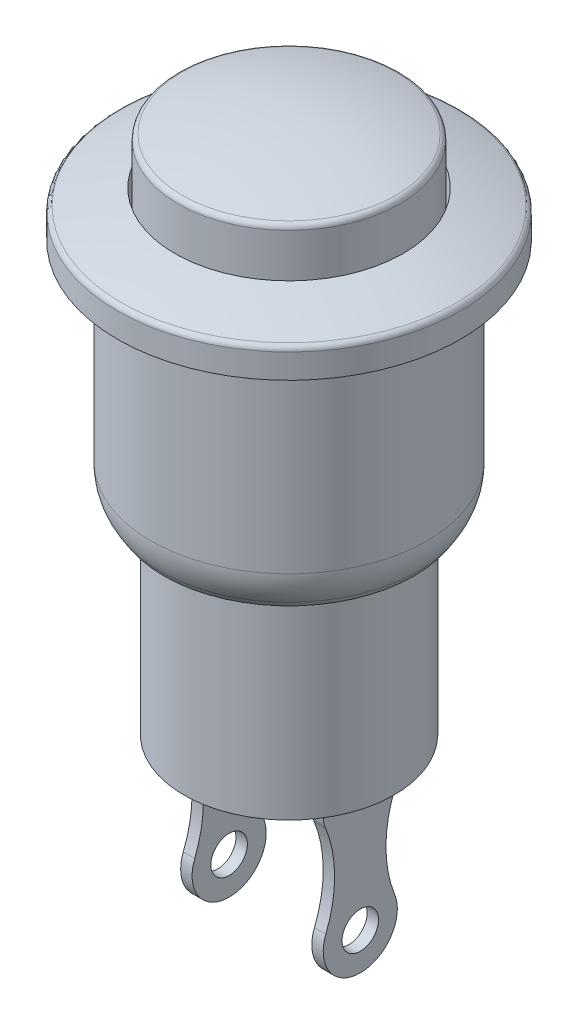
ISO-10303-21;
HEADER;
FILE_DESCRIPTION(('STEP AP214'),'2;1');
FILE_NAME('part.step','',(''),(''),'','','');
FILE_SCHEMA(('AUTOMOTIVE_DESIGN { 1 0 10303 214 1 1 1 1 }'));
ENDSEC;
DATA;
#1=APPLICATION_CONTEXT('core data for automotive mechanical design processes');
#2=APPLICATION_PROTOCOL_DEFINITION('international standard','automotive_design',2000,#1);
#3=PRODUCT_CONTEXT('',#1,'mechanical');
#4=PRODUCT('Part','Part','',(#3));
#5=PRODUCT_RELATED_PRODUCT_CATEGORY('part','',(#4));
#6=PRODUCT_DEFINITION_FORMATION('','',#4);
#7=PRODUCT_DEFINITION_CONTEXT('part definition',#1,'design');
#8=PRODUCT_DEFINITION('design','',#6,#7);
#9=PRODUCT_DEFINITION_SHAPE('','',#8);
#10=(LENGTH_UNIT() NAMED_UNIT(*) SI_UNIT(.MILLI.,.METRE.));
#11=(NAMED_UNIT(*) PLANE_ANGLE_UNIT() SI_UNIT($,.RADIAN.));
#12=(NAMED_UNIT(*) SI_UNIT($,.STERADIAN.) SOLID_ANGLE_UNIT());
#13=UNCERTAINTY_MEASURE_WITH_UNIT(LENGTH_MEASURE(1.E-05),#10,'distance_accuracy_value','');
#14=(GEOMETRIC_REPRESENTATION_CONTEXT(3) GLOBAL_UNCERTAINTY_ASSIGNED_CONTEXT((#13)) GLOBAL_UNIT_ASSIGNED_CONTEXT((#10,
#11,#12)) REPRESENTATION_CONTEXT('',''));
#15=CARTESIAN_POINT('',(0.,0.,0.));
#16=DIRECTION('',(0.,0.,1.));
#17=DIRECTION('',(1.,0.,0.));
#18=AXIS2_PLACEMENT_3D('',#15,#16,#17);
#19=CARTESIAN_POINT('',(-2.5,-6.,-1.3));
#20=DIRECTION('',(0.,0.,1.));
#21=DIRECTION('',(1.,0.,0.));
#22=AXIS2_PLACEMENT_3D('',#19,#20,#21);
#23=PLANE('',#22);
#24=DIRECTION('',(0.,1.,0.));
#25=VECTOR('',#24,1.);
#26=CARTESIAN_POINT('',(-2.1,-6.,-1.3));
#27=LINE('',#26,#25);
#28=CARTESIAN_POINT('',(-2.1,-0.59175240236366,-1.3));
#29=VERTEX_POINT('',#28);
#30=CARTESIAN_POINT('',(-2.1,0.,-1.3));
#31=VERTEX_POINT('',#30);
#32=EDGE_CURVE('E239',#29,#31,#27,.T.);
#33=ORIENTED_EDGE('',*,*,#32,.F.);
#34=DIRECTION('',(-1.,0.,0.));
#35=VECTOR('',#34,1.);
#36=CARTESIAN_POINT('',(-2.5,-0.59175240236366,-1.3));
#37=LINE('',#36,#35);
#38=CARTESIAN_POINT('',(-2.5,-0.59175240236366,-1.3));
#39=VERTEX_POINT('',#38);
#40=EDGE_CURVE('E44',#29,#39,#37,.T.);
#41=ORIENTED_EDGE('',*,*,#40,.T.);
#42=DIRECTION('',(0.,1.,0.));
#43=VECTOR('',#42,1.);
#44=CARTESIAN_POINT('',(-2.5,-6.,-1.3));
#45=LINE('',#44,#43);
#46=CARTESIAN_POINT('',(-2.5,0.,-1.3));
#47=VERTEX_POINT('',#46);
#48=EDGE_CURVE('E241',#39,#47,#45,.T.);
#49=ORIENTED_EDGE('',*,*,#48,.T.);
#50=DIRECTION('',(1.,0.,0.));
#51=VECTOR('',#50,1.);
#52=CARTESIAN_POINT('',(-2.5,0.,-1.3));
#53=LINE('',#52,#51);
#54=EDGE_CURVE('E226',#47,#31,#53,.T.);
#55=ORIENTED_EDGE('',*,*,#54,.T.);
#56=EDGE_LOOP('',(#33,#41,#49,#55));
#57=FACE_BOUND('',#56,.T.);
#58=ADVANCED_FACE('F36',(#57),#23,.F.);
#59=CARTESIAN_POINT('',(2.5,-6.,-1.3));
#60=DIRECTION('',(0.,0.,1.));
#61=DIRECTION('',(1.,0.,0.));
#62=AXIS2_PLACEMENT_3D('',#59,#60,#61);
#63=PLANE('',#62);
#64=DIRECTION('',(0.,1.,0.));
#65=VECTOR('',#64,1.);
#66=CARTESIAN_POINT('',(2.5,-6.,-1.3));
#67=LINE('',#66,#65);
#68=CARTESIAN_POINT('',(2.5,-0.59175240236366,-1.3));
#69=VERTEX_POINT('',#68);
#70=CARTESIAN_POINT('',(2.5,0.,-1.3));
#71=VERTEX_POINT('',#70);
#72=EDGE_CURVE('E217',#69,#71,#67,.T.);
#73=ORIENTED_EDGE('',*,*,#72,.F.);
#74=DIRECTION('',(-1.,0.,0.));
#75=VECTOR('',#74,1.);
#76=CARTESIAN_POINT('',(2.5,-0.59175240236366,-1.3));
#77=LINE('',#76,#75);
#78=CARTESIAN_POINT('',(2.1,-0.59175240236366,-1.3));
#79=VERTEX_POINT('',#78);
#80=EDGE_CURVE('E315',#69,#79,#77,.T.);
#81=ORIENTED_EDGE('',*,*,#80,.T.);
#82=DIRECTION('',(0.,1.,0.));
#83=VECTOR('',#82,1.);
#84=CARTESIAN_POINT('',(2.1,-6.,-1.3));
#85=LINE('',#84,#83);
#86=CARTESIAN_POINT('',(2.1,0.,-1.3));
#87=VERTEX_POINT('',#86);
#88=EDGE_CURVE('E219',#79,#87,#85,.T.);
#89=ORIENTED_EDGE('',*,*,#88,.T.);
#90=DIRECTION('',(1.,0.,0.));
#91=VECTOR('',#90,1.);
#92=CARTESIAN_POINT('',(2.5,0.,-1.3));
#93=LINE('',#92,#91);
#94=EDGE_CURVE('E209',#87,#71,#93,.T.);
#95=ORIENTED_EDGE('',*,*,#94,.T.);
#96=EDGE_LOOP('',(#73,#81,#89,#95));
#97=FACE_BOUND('',#96,.T.);
#98=ADVANCED_FACE('F353',(#97),#63,.F.);
#99=CARTESIAN_POINT('',(0.,0.,0.));
#100=DIRECTION('',(0.,-1.,0.));
#101=DIRECTION('',(0.,0.,-1.));
#102=AXIS2_PLACEMENT_3D('',#99,#100,#101);
#103=PLANE('',#102);
#104=ORIENTED_EDGE('',*,*,#54,.F.);
#105=DIRECTION('',(0.,0.,-1.));
#106=VECTOR('',#105,1.);
#107=CARTESIAN_POINT('',(-2.5,0.,1.3));
#108=LINE('',#107,#106);
#109=CARTESIAN_POINT('',(-2.5,0.,1.3));
#110=VERTEX_POINT('',#109);
#111=EDGE_CURVE('E223',#110,#47,#108,.T.);
#112=ORIENTED_EDGE('',*,*,#111,.F.);
#113=DIRECTION('',(-1.,0.,0.));
#114=VECTOR('',#113,1.);
#115=CARTESIAN_POINT('',(-2.5,0.,1.3));
#116=LINE('',#115,#114);
#117=CARTESIAN_POINT('',(-2.1,0.,1.3));
#118=VERTEX_POINT('',#117);
#119=EDGE_CURVE('E232',#118,#110,#116,.T.);
#120=ORIENTED_EDGE('',*,*,#119,.F.);
#121=DIRECTION('',(0.,0.,1.));
#122=VECTOR('',#121,1.);
#123=CARTESIAN_POINT('',(-2.1,0.,1.3));
#124=LINE('',#123,#122);
#125=EDGE_CURVE('E229',#31,#118,#124,.T.);
#126=ORIENTED_EDGE('',*,*,#125,.F.);
#127=EDGE_LOOP('',(#104,#112,#120,#126));
#128=FACE_BOUND('',#127,.T.);
#129=CARTESIAN_POINT('',(0.,0.,0.));
#130=DIRECTION('',(0.,-1.,0.));
#131=DIRECTION('',(0.,0.,-1.));
#132=AXIS2_PLACEMENT_3D('',#129,#130,#131);
#133=CIRCLE('',#132,3.69);
#134=CARTESIAN_POINT('',(0.,0.,-3.69));
#135=VERTEX_POINT('',#134);
#136=EDGE_CURVE('E252',#135,#135,#133,.T.);
#137=ORIENTED_EDGE('',*,*,#136,.T.);
#138=EDGE_LOOP('',(#137));
#139=FACE_BOUND('',#138,.T.);
#140=DIRECTION('',(0.,0.,-1.));
#141=VECTOR('',#140,1.);
#142=CARTESIAN_POINT('',(2.1,0.,1.3));
#143=LINE('',#142,#141);
#144=CARTESIAN_POINT('',(2.1,0.,1.3));
#145=VERTEX_POINT('',#144);
#146=EDGE_CURVE('E206',#145,#87,#143,.T.);
#147=ORIENTED_EDGE('',*,*,#146,.F.);
#148=DIRECTION('',(-1.,0.,0.));
#149=VECTOR('',#148,1.);
#150=CARTESIAN_POINT('',(2.5,0.,1.3));
#151=LINE('',#150,#149);
#152=CARTESIAN_POINT('',(2.5,0.,1.3));
#153=VERTEX_POINT('',#152);
#154=EDGE_CURVE('E203',#153,#145,#151,.T.);
#155=ORIENTED_EDGE('',*,*,#154,.F.);
#156=DIRECTION('',(0.,0.,1.));
#157=VECTOR('',#156,1.);
#158=CARTESIAN_POINT('',(2.5,0.,1.3));
#159=LINE('',#158,#157);
#160=EDGE_CURVE('E212',#71,#153,#159,.T.);
#161=ORIENTED_EDGE('',*,*,#160,.F.);
#162=ORIENTED_EDGE('',*,*,#94,.F.);
#163=EDGE_LOOP('',(#147,#155,#161,#162));
#164=FACE_BOUND('',#163,.T.);
#165=ADVANCED_FACE('F330',(#128,#139,#164),#103,.T.);
#166=CARTESIAN_POINT('',(0.,0.,0.));
#167=DIRECTION('',(0.,-1.,0.));
#168=DIRECTION('',(0.,0.,-1.));
#169=AXIS2_PLACEMENT_3D('',#166,#167,#168);
#170=CYLINDRICAL_SURFACE('',#169,6.01);
#171=CARTESIAN_POINT('',(0.,15.8594915447855,0.));
#172=DIRECTION('',(0.,-1.,0.));
#173=DIRECTION('',(0.,0.,-1.));
#174=AXIS2_PLACEMENT_3D('',#171,#172,#173);
#175=CIRCLE('',#174,6.01);
#176=CARTESIAN_POINT('',(0.,15.8594915447855,-6.01));
#177=VERTEX_POINT('',#176);
#178=EDGE_CURVE('E270',#177,#177,#175,.T.);
#179=ORIENTED_EDGE('',*,*,#178,.T.);
#180=EDGE_LOOP('',(#179));
#181=FACE_BOUND('',#180,.T.);
#182=CARTESIAN_POINT('',(0.,15.,0.));
#183=DIRECTION('',(0.,-1.,0.));
#184=DIRECTION('',(0.,0.,-1.));
#185=AXIS2_PLACEMENT_3D('',#182,#183,#184);
#186=CIRCLE('',#185,6.01);
#187=CARTESIAN_POINT('',(0.,15.,-6.01));
#188=VERTEX_POINT('',#187);
#189=EDGE_CURVE('E243',#188,#188,#186,.T.);
#190=ORIENTED_EDGE('',*,*,#189,.F.);
#191=EDGE_LOOP('',(#190));
#192=FACE_BOUND('',#191,.T.);
#193=ADVANCED_FACE('F385',(#181,#192),#170,.T.);
#194=CARTESIAN_POINT('',(0.,-0.466749999999985,0.));
#195=DIRECTION('',(0.,-1.,0.));
#196=DIRECTION('',(1.,0.,0.));
#197=AXIS2_PLACEMENT_3D('',#194,#195,#196);
#198=SPHERICAL_SURFACE('',#197,17.5292314595506);
#199=CARTESIAN_POINT('',(0.,16.0479158448809,0.));
#200=DIRECTION('',(0.,-1.,0.));
#201=DIRECTION('',(0.,0.,-1.));
#202=AXIS2_PLACEMENT_3D('',#199,#200,#201);
#203=CIRCLE('',#202,5.87705432971521);
#204=CARTESIAN_POINT('',(5.87705432971521,16.0479158448809,0.));
#205=VERTEX_POINT('',#204);
#206=EDGE_CURVE('E273',#205,#205,#203,.F.);
#207=CARTESIAN_POINT('',(0.,16.6,0.));
#208=DIRECTION('',(0.,-1.,0.));
#209=DIRECTION('',(0.,0.,-1.));
#210=AXIS2_PLACEMENT_3D('',#207,#208,#209);
#211=CIRCLE('',#210,4.);
#212=CARTESIAN_POINT('',(3.99999999999999,16.6,0.));
#213=VERTEX_POINT('',#212);
#214=EDGE_CURVE('E261',#213,#213,#211,.T.);
#215=CARTESIAN_POINT('',(5.87705432971521,16.0479158448809,0.));
#216=CARTESIAN_POINT('',(5.85784312004759,16.0547525151923,0.));
#217=CARTESIAN_POINT('',(5.83861998081771,16.0615556631403,0.));
#218=CARTESIAN_POINT('',(5.80015007757914,16.0750948320988,0.));
#219=CARTESIAN_POINT('',(5.78090331357046,16.0818308531093,0.));
#220=CARTESIAN_POINT('',(5.74238639511996,16.0952356859819,0.));
#221=CARTESIAN_POINT('',(5.72311624067815,16.1019044978441,0.));
#222=CARTESIAN_POINT('',(5.68455277606906,16.1151748312468,0.));
#223=CARTESIAN_POINT('',(5.66525946590178,16.1217763527873,0.));
#224=CARTESIAN_POINT('',(5.62664992481077,16.1349120251345,0.));
#225=CARTESIAN_POINT('',(5.60733369388703,16.1414461759411,0.));
#226=CARTESIAN_POINT('',(5.56867854653681,16.1544470272442,0.));
#227=CARTESIAN_POINT('',(5.54933963011032,16.1609137277407,0.));
#228=CARTESIAN_POINT('',(5.51063934728309,16.1737795996646,0.));
#229=CARTESIAN_POINT('',(5.49127798088235,16.1801787710921,0.));
#230=CARTESIAN_POINT('',(5.45253303390894,16.1929095069428,0.));
#231=CARTESIAN_POINT('',(5.43314945333626,16.199241071366,0.));
#232=CARTESIAN_POINT('',(5.39436031409174,16.2118365160957,0.));
#233=CARTESIAN_POINT('',(5.37495475541988,16.2181003964023,0.));
#234=CARTESIAN_POINT('',(5.33612189631747,16.2305603966112,0.));
#235=CARTESIAN_POINT('',(5.31669459588691,16.2367565165134,0.));
#236=CARTESIAN_POINT('',(5.27781848987231,16.2490809204508,0.));
#237=CARTESIAN_POINT('',(5.25836968428827,16.2552092044861,0.));
#238=CARTESIAN_POINT('',(5.21945080483389,16.2673978620531,0.));
#239=CARTESIAN_POINT('',(5.19998073096354,16.2734582355849,0.));
#240=CARTESIAN_POINT('',(5.16101955206271,16.2855109983358,0.));
#241=CARTESIAN_POINT('',(5.14152844703223,16.2915033875549,0.));
#242=CARTESIAN_POINT('',(5.10252544319347,16.303420108699,0.));
#243=CARTESIAN_POINT('',(5.08301354438519,16.309344440624,0.));
#244=CARTESIAN_POINT('',(5.04396919062639,16.3211249750274,0.));
#245=CARTESIAN_POINT('',(5.02443673567587,16.3269811775058,0.));
#246=CARTESIAN_POINT('',(4.98535150751851,16.3386253816932,0.));
#247=CARTESIAN_POINT('',(4.96579873431168,16.3444133834023,0.));
#248=CARTESIAN_POINT('',(4.92667310777508,16.355921115559,0.));
#249=CARTESIAN_POINT('',(4.90710025444532,16.3616408460067,0.));
#250=CARTESIAN_POINT('',(4.86793470604079,16.3730119659798,0.));
#251=CARTESIAN_POINT('',(4.84834201096604,16.3786633555054,0.));
#252=CARTESIAN_POINT('',(4.80913701769111,16.3898977248061,0.));
#253=CARTESIAN_POINT('',(4.78952471949094,16.3954807045813,0.));
#254=CARTESIAN_POINT('',(4.75028075882353,16.406578186386,0.));
#255=CARTESIAN_POINT('',(4.73064909635629,16.4120926884156,0.));
#256=CARTESIAN_POINT('',(4.69136664624891,16.4230531475681,0.));
#257=CARTESIAN_POINT('',(4.67171585860877,16.428499104691,0.));
#258=CARTESIAN_POINT('',(4.6323953974827,16.4393224077037,0.));
#259=CARTESIAN_POINT('',(4.61272572399676,16.4446997535935,0.));
#260=CARTESIAN_POINT('',(4.57336773073619,16.4553857686493,0.));
#261=CARTESIAN_POINT('',(4.55367941096156,16.4606944378153,0.));
#262=CARTESIAN_POINT('',(4.51428436490781,16.4712430347691,0.));
#263=CARTESIAN_POINT('',(4.49457763862869,16.476482962557,0.));
#264=CARTESIAN_POINT('',(4.45514601957433,16.4868940129374,0.));
#265=CARTESIAN_POINT('',(4.4354211267991,16.49206513553,0.));
#266=CARTESIAN_POINT('',(4.39595341498215,16.5023385125408,0.));
#267=CARTESIAN_POINT('',(4.37621059594045,16.5074407669591,0.));
#268=CARTESIAN_POINT('',(4.33670727203844,16.5175763454805,0.));
#269=CARTESIAN_POINT('',(4.31694676717815,16.5226096695838,0.));
#270=CARTESIAN_POINT('',(4.27740831230255,16.5326073261753,0.));
#271=CARTESIAN_POINT('',(4.25763036228723,16.5375716586636,0.));
#272=CARTESIAN_POINT('',(4.21805725797658,16.5474312715611,0.));
#273=CARTESIAN_POINT('',(4.19826210368124,16.5523265519703,0.));
#274=CARTESIAN_POINT('',(4.15865483189893,16.5620480011029,0.));
#275=CARTESIAN_POINT('',(4.13884271441195,16.5668741698262,0.));
#276=CARTESIAN_POINT('',(4.09920175752693,16.5764573367613,0.));
#277=CARTESIAN_POINT('',(4.07937291812888,16.581214334973,0.));
#278=CARTESIAN_POINT('',(4.03969875895973,16.5906591031276,0.));
#279=CARTESIAN_POINT('',(4.01985343918863,16.5953468730704,0.));
#280=CARTESIAN_POINT('',(3.99999999999999,16.6,0.));
#281=B_SPLINE_CURVE_WITH_KNOTS('',3,(#215,#216,#217,#218,#219,#220,#221,#222,#223,#224,#225,
#226,#227,#228,#229,#230,#231,#232,#233,#234,#235,#236,#237,#238,#239,#240,#241,#242,#243,#244,
#245,#246,#247,#248,#249,#250,#251,#252,#253,#254,#255,#256,#257,#258,#259,#260,#261,#262,#263,
#264,#265,#266,#267,#268,#269,#270,#271,#272,#273,#274,#275,#276,#277,#278,#279,#280),
.UNSPECIFIED.,.F.,.F.,(4,2,2,2,2,2,2,2,2,2,2,2,2,2,2,2,2,2,2,2,2,2,2,2,2,2,2,2,2,2,2,2,4),(0.,
0.0611742751673028,0.122348550334602,0.183522825501902,0.244697100669206,0.30587137583651,
0.367045651003811,0.428219926171109,0.489394201338413,0.550568476505716,0.611742751673016,
0.672917026840316,0.73409130200762,0.795265577174924,0.856439852342224,0.917614127509524,
0.978788402676828,1.03996267784413,1.10113695301143,1.16231122817873,1.22348550334603,
1.28465977851334,1.34583405368064,1.40700832884794,1.46818260401524,1.52935687918254,
1.59053115434984,1.65170542951714,1.71287970468445,1.77405397985175,1.83522825501905,
1.89640253018635,1.95757680535365),.UNSPECIFIED.);
#282=EDGE_CURVE('BSEAM400',#205,#213,#281,.T.);
#283=ORIENTED_EDGE('',*,*,#206,.T.);
#284=ORIENTED_EDGE('',*,*,#214,.T.);
#285=ORIENTED_EDGE('',*,*,#282,.T.);
#286=ORIENTED_EDGE('',*,*,#282,.F.);
#287=EDGE_LOOP('',(#283,#285,#284,#286));
#288=FACE_BOUND('',#287,.T.);
#289=ADVANCED_FACE('F400',(#288),#198,.T.);
#290=CARTESIAN_POINT('',(0.,0.,0.));
#291=DIRECTION('',(0.,-1.,0.));
#292=DIRECTION('',(0.,0.,-1.));
#293=AXIS2_PLACEMENT_3D('',#290,#291,#292);
#294=CYLINDRICAL_SURFACE('',#293,4.);
#295=CARTESIAN_POINT('',(0.,15.0131906379404,0.));
#296=DIRECTION('',(0.,-1.,0.));
#297=DIRECTION('',(0.,0.,-1.));
#298=AXIS2_PLACEMENT_3D('',#295,#296,#297);
#299=CIRCLE('',#298,4.);
#300=CARTESIAN_POINT('',(0.,15.0131906379404,-4.));
#301=VERTEX_POINT('',#300);
#302=EDGE_CURVE('E258',#301,#301,#299,.T.);
#303=ORIENTED_EDGE('',*,*,#302,.T.);
#304=EDGE_LOOP('',(#303));
#305=FACE_BOUND('',#304,.T.);
#306=ORIENTED_EDGE('',*,*,#214,.F.);
#307=EDGE_LOOP('',(#306));
#308=FACE_BOUND('',#307,.T.);
#309=ADVANCED_FACE('F396',(#305,#308),#294,.F.);
#310=CARTESIAN_POINT('',(0.,15.0131906379404,0.));
#311=DIRECTION('',(0.,1.,0.));
#312=DIRECTION('',(0.,0.,1.));
#313=AXIS2_PLACEMENT_3D('',#310,#311,#312);
#314=PLANE('',#313);
#315=CARTESIAN_POINT('',(0.,15.0131906379404,0.));
#316=DIRECTION('',(0.,-1.,0.));
#317=DIRECTION('',(0.,0.,-1.));
#318=AXIS2_PLACEMENT_3D('',#315,#316,#317);
#319=CIRCLE('',#318,3.89);
#320=CARTESIAN_POINT('',(0.,15.0131906379404,-3.89));
#321=VERTEX_POINT('',#320);
#322=EDGE_CURVE('E255',#321,#321,#319,.T.);
#323=ORIENTED_EDGE('',*,*,#322,.T.);
#324=EDGE_LOOP('',(#323));
#325=FACE_BOUND('',#324,.T.);
#326=ORIENTED_EDGE('',*,*,#302,.F.);
#327=EDGE_LOOP('',(#326));
#328=FACE_BOUND('',#327,.T.);
#329=ADVANCED_FACE('F392',(#325,#328),#314,.T.);
#330=CARTESIAN_POINT('',(0.,0.,0.));
#331=DIRECTION('',(0.,-1.,0.));
#332=DIRECTION('',(0.,0.,-1.));
#333=AXIS2_PLACEMENT_3D('',#330,#331,#332);
#334=CYLINDRICAL_SURFACE('',#333,3.89);
#335=CARTESIAN_POINT('',(0.,18.0525692696262,0.));
#336=DIRECTION('',(0.,-1.,0.));
#337=DIRECTION('',(0.,0.,-1.));
#338=AXIS2_PLACEMENT_3D('',#335,#336,#337);
#339=CIRCLE('',#338,3.89);
#340=CARTESIAN_POINT('',(0.,18.0525692696262,-3.89));
#341=VERTEX_POINT('',#340);
#342=EDGE_CURVE('E264',#341,#341,#339,.T.);
#343=ORIENTED_EDGE('',*,*,#342,.T.);
#344=EDGE_LOOP('',(#343));
#345=FACE_BOUND('',#344,.T.);
#346=ORIENTED_EDGE('',*,*,#322,.F.);
#347=EDGE_LOOP('',(#346));
#348=FACE_BOUND('',#347,.T.);
#349=ADVANCED_FACE('F388',(#345,#348),#334,.T.);
#350=CARTESIAN_POINT('',(0.,5.88991666666667,0.));
#351=DIRECTION('',(0.,-1.,0.));
#352=DIRECTION('',(1.,0.,0.));
#353=AXIS2_PLACEMENT_3D('',#350,#351,#352);
#354=SPHERICAL_SURFACE('',#353,12.9100833333333);
#355=CARTESIAN_POINT('',(0.,18.2439551525348,0.));
#356=DIRECTION('',(0.,-1.,0.));
#357=DIRECTION('',(0.,0.,-1.));
#358=AXIS2_PLACEMENT_3D('',#355,#356,#357);
#359=CIRCLE('',#358,3.74806413543053);
#360=CARTESIAN_POINT('',(0.,18.2439551525348,-3.74806413543053));
#361=VERTEX_POINT('',#360);
#362=EDGE_CURVE('E267',#361,#361,#359,.F.);
#363=ORIENTED_EDGE('',*,*,#362,.T.);
#364=EDGE_LOOP('',(#363));
#365=FACE_BOUND('',#364,.T.);
#366=ADVANCED_FACE('F381',(#365),#354,.T.);
#367=CARTESIAN_POINT('',(0.,0.,0.));
#368=DIRECTION('',(0.,-1.,0.));
#369=DIRECTION('',(0.,0.,-1.));
#370=AXIS2_PLACEMENT_3D('',#367,#368,#369);
#371=CYLINDRICAL_SURFACE('',#370,3.69);
#372=CARTESIAN_POINT('',(0.,7.,0.));
#373=DIRECTION('',(0.,-1.,0.));
#374=DIRECTION('',(0.,0.,-1.));
#375=AXIS2_PLACEMENT_3D('',#372,#373,#374);
#376=CIRCLE('',#375,3.69);
#377=CARTESIAN_POINT('',(0.,7.,-3.69));
#378=VERTEX_POINT('',#377);
#379=EDGE_CURVE('E249',#378,#378,#376,.T.);
#380=ORIENTED_EDGE('',*,*,#379,.T.);
#381=EDGE_LOOP('',(#380));
#382=FACE_BOUND('',#381,.T.);
#383=ORIENTED_EDGE('',*,*,#136,.F.);
#384=EDGE_LOOP('',(#383));
#385=FACE_BOUND('',#384,.T.);
#386=ADVANCED_FACE('F377',(#382,#385),#371,.T.);
#387=CARTESIAN_POINT('',(0.,7.,0.));
#388=DIRECTION('',(0.,-1.,0.));
#389=DIRECTION('',(0.,0.,-1.));
#390=AXIS2_PLACEMENT_3D('',#387,#388,#389);
#391=PLANE('',#390);
#392=CARTESIAN_POINT('',(0.,7.,0.));
#393=DIRECTION('',(0.,-1.,0.));
#394=DIRECTION('',(0.,0.,-1.));
#395=AXIS2_PLACEMENT_3D('',#392,#393,#394);
#396=CIRCLE('',#395,4.38541468476175);
#397=CARTESIAN_POINT('',(0.,7.,-4.38541468476175));
#398=VERTEX_POINT('',#397);
#399=EDGE_CURVE('E276',#398,#398,#396,.T.);
#400=ORIENTED_EDGE('',*,*,#399,.T.);
#401=EDGE_LOOP('',(#400));
#402=FACE_BOUND('',#401,.T.);
#403=ORIENTED_EDGE('',*,*,#379,.F.);
#404=EDGE_LOOP('',(#403));
#405=FACE_BOUND('',#404,.T.);
#406=ADVANCED_FACE('F373',(#402,#405),#391,.T.);
#407=CARTESIAN_POINT('',(0.,0.,0.));
#408=DIRECTION('',(0.,-1.,0.));
#409=DIRECTION('',(0.,0.,-1.));
#410=AXIS2_PLACEMENT_3D('',#407,#408,#409);
#411=CYLINDRICAL_SURFACE('',#410,4.84);
#412=CARTESIAN_POINT('',(0.,8.29242698992415,0.));
#413=DIRECTION('',(0.,-1.,0.));
#414=DIRECTION('',(0.,0.,-1.));
#415=AXIS2_PLACEMENT_3D('',#412,#413,#414);
#416=CIRCLE('',#415,4.84);
#417=CARTESIAN_POINT('',(0.,8.29242698992415,-4.84));
#418=VERTEX_POINT('',#417);
#419=EDGE_CURVE('E279',#418,#418,#416,.F.);
#420=ORIENTED_EDGE('',*,*,#419,.T.);
#421=EDGE_LOOP('',(#420));
#422=FACE_BOUND('',#421,.T.);
#423=CARTESIAN_POINT('',(0.,15.,0.));
#424=DIRECTION('',(0.,-1.,0.));
#425=DIRECTION('',(0.,0.,-1.));
#426=AXIS2_PLACEMENT_3D('',#423,#424,#425);
#427=CIRCLE('',#426,4.84);
#428=CARTESIAN_POINT('',(0.,15.,-4.84));
#429=VERTEX_POINT('',#428);
#430=EDGE_CURVE('E246',#429,#429,#427,.T.);
#431=ORIENTED_EDGE('',*,*,#430,.T.);
#432=EDGE_LOOP('',(#431));
#433=FACE_BOUND('',#432,.T.);
#434=ADVANCED_FACE('F369',(#422,#433),#411,.T.);
#435=CARTESIAN_POINT('',(0.,15.,0.));
#436=DIRECTION('',(0.,-1.,0.));
#437=DIRECTION('',(0.,0.,-1.));
#438=AXIS2_PLACEMENT_3D('',#435,#436,#437);
#439=PLANE('',#438);
#440=ORIENTED_EDGE('',*,*,#189,.T.);
#441=EDGE_LOOP('',(#440));
#442=FACE_BOUND('',#441,.T.);
#443=ORIENTED_EDGE('',*,*,#430,.F.);
#444=EDGE_LOOP('',(#443));
#445=FACE_BOUND('',#444,.T.);
#446=ADVANCED_FACE('F365',(#442,#445),#439,.T.);
#447=CARTESIAN_POINT('',(0.,18.0525692696262,0.));
#448=DIRECTION('',(0.,-1.,0.));
#449=DIRECTION('',(0.,0.,-1.));
#450=AXIS2_PLACEMENT_3D('',#447,#448,#449);
#451=TOROIDAL_SURFACE('',#450,3.69,0.2);
#452=ORIENTED_EDGE('',*,*,#362,.F.);
#453=EDGE_LOOP('',(#452));
#454=FACE_BOUND('',#453,.T.);
#455=ORIENTED_EDGE('',*,*,#342,.F.);
#456=EDGE_LOOP('',(#455));
#457=FACE_BOUND('',#456,.T.);
#458=ADVANCED_FACE('F368',(#454,#457),#451,.T.);
#459=CARTESIAN_POINT('',(0.,15.8594915447855,0.));
#460=DIRECTION('',(0.,-1.,0.));
#461=DIRECTION('',(0.,0.,-1.));
#462=AXIS2_PLACEMENT_3D('',#459,#460,#461);
#463=TOROIDAL_SURFACE('',#462,5.81,0.2);
#464=ORIENTED_EDGE('',*,*,#206,.F.);
#465=EDGE_LOOP('',(#464));
#466=FACE_BOUND('',#465,.T.);
#467=ORIENTED_EDGE('',*,*,#178,.F.);
#468=EDGE_LOOP('',(#467));
#469=FACE_BOUND('',#468,.T.);
#470=ADVANCED_FACE('F410',(#466,#469),#463,.T.);
#471=CARTESIAN_POINT('',(0.,7.,0.));
#472=DIRECTION('',(0.,1.,0.));
#473=DIRECTION('',(0.,0.,1.));
#474=AXIS2_PLACEMENT_3D('',#471,#472,#473);
#475=CONICAL_SURFACE('',#474,4.38541468476175,0.575958653158124);
#476=CARTESIAN_POINT('',(0.,7.2031489198941,0.));
#477=DIRECTION('',(0.,-1.,0.));
#478=DIRECTION('',(0.,0.,-1.));
#479=AXIS2_PLACEMENT_3D('',#476,#477,#478);
#480=CIRCLE('',#479,4.51734113589085);
#481=CARTESIAN_POINT('',(0.,7.2031489198941,-4.51734113589085));
#482=VERTEX_POINT('',#481);
#483=EDGE_CURVE('E282',#482,#482,#480,.T.);
#484=ORIENTED_EDGE('',*,*,#483,.T.);
#485=EDGE_LOOP('',(#484));
#486=FACE_BOUND('',#485,.T.);
#487=ORIENTED_EDGE('',*,*,#399,.F.);
#488=EDGE_LOOP('',(#487));
#489=FACE_BOUND('',#488,.T.);
#490=ADVANCED_FACE('F414',(#486,#489),#475,.T.);
#491=CARTESIAN_POINT('',(0.,8.29242698992415,0.));
#492=DIRECTION('',(0.,-1.,0.));
#493=DIRECTION('',(0.,0.,-1.));
#494=AXIS2_PLACEMENT_3D('',#491,#492,#493);
#495=TOROIDAL_SURFACE('',#494,2.84,2.);
#496=ORIENTED_EDGE('',*,*,#483,.F.);
#497=EDGE_LOOP('',(#496));
#498=FACE_BOUND('',#497,.T.);
#499=ORIENTED_EDGE('',*,*,#419,.F.);
#500=EDGE_LOOP('',(#499));
#501=FACE_BOUND('',#500,.T.);
#502=ADVANCED_FACE('F363',(#498,#501),#495,.T.);
#503=CARTESIAN_POINT('',(-2.5,-6.,1.3));
#504=DIRECTION('',(1.,0.,0.));
#505=DIRECTION('',(0.,0.,-1.));
#506=AXIS2_PLACEMENT_3D('',#503,#504,#505);
#507=PLANE('',#506);
#508=CARTESIAN_POINT('',(-2.5,-4.7,0.));
#509=DIRECTION('',(-1.,0.,0.));
#510=DIRECTION('',(0.,0.,1.));
#511=AXIS2_PLACEMENT_3D('',#508,#509,#510);
#512=CIRCLE('',#511,0.64);
#513=CARTESIAN_POINT('',(-2.5,-4.7,0.64));
#514=VERTEX_POINT('',#513);
#515=EDGE_CURVE('E193',#514,#514,#512,.T.);
#516=ORIENTED_EDGE('',*,*,#515,.F.);
#517=EDGE_LOOP('',(#516));
#518=FACE_BOUND('',#517,.T.);
#519=CARTESIAN_POINT('',(-2.5,-2.61666666666667,5.22534722222222));
#520=DIRECTION('',(-1.,0.,0.));
#521=DIRECTION('',(0.,0.,-1.));
#522=AXIS2_PLACEMENT_3D('',#519,#520,#521);
#523=CIRCLE('',#522,4.32534722222222);
#524=CARTESIAN_POINT('',(-2.5,-0.971993197903382,1.22488752689574));
#525=VERTEX_POINT('',#524);
#526=CARTESIAN_POINT('',(-2.5,-4.2185482377631,1.20756126165052));
#527=VERTEX_POINT('',#526);
#528=EDGE_CURVE('E150',#525,#527,#523,.T.);
#529=ORIENTED_EDGE('',*,*,#528,.F.);
#530=CARTESIAN_POINT('',(-2.5,-0.591752402363664,0.299999999999999));
#531=DIRECTION('',(1.,0.,0.));
#532=DIRECTION('',(0.,0.,-1.));
#533=AXIS2_PLACEMENT_3D('',#530,#531,#532);
#534=CIRCLE('',#533,1.);
#535=CARTESIAN_POINT('',(-2.5,-0.591752402363664,1.3));
#536=VERTEX_POINT('',#535);
#537=EDGE_CURVE('E308',#525,#536,#534,.F.);
#538=ORIENTED_EDGE('',*,*,#537,.T.);
#539=DIRECTION('',(0.,1.,0.));
#540=VECTOR('',#539,1.);
#541=CARTESIAN_POINT('',(-2.5,-6.,1.3));
#542=LINE('',#541,#540);
#543=EDGE_CURVE('E235',#536,#110,#542,.T.);
#544=ORIENTED_EDGE('',*,*,#543,.T.);
#545=ORIENTED_EDGE('',*,*,#111,.T.);
#546=ORIENTED_EDGE('',*,*,#48,.F.);
#547=CARTESIAN_POINT('',(-2.5,-0.59175240236366,-0.300000000000001));
#548=DIRECTION('',(1.,0.,0.));
#549=DIRECTION('',(0.,0.,-1.));
#550=AXIS2_PLACEMENT_3D('',#547,#548,#549);
#551=CIRCLE('',#550,1.);
#552=CARTESIAN_POINT('',(-2.5,-0.971993197903378,-1.22488752689574));
#553=VERTEX_POINT('',#552);
#554=EDGE_CURVE('E306',#39,#553,#551,.F.);
#555=ORIENTED_EDGE('',*,*,#554,.T.);
#556=CARTESIAN_POINT('',(-2.5,-2.61666666666667,-5.22534722222222));
#557=DIRECTION('',(-1.,0.,0.));
#558=DIRECTION('',(0.,0.,1.));
#559=AXIS2_PLACEMENT_3D('',#556,#557,#558);
#560=CIRCLE('',#559,4.32534722222222);
#561=CARTESIAN_POINT('',(-2.5,-4.2185482377631,-1.20756126165051));
#562=VERTEX_POINT('',#561);
#563=EDGE_CURVE('E164',#562,#553,#560,.T.);
#564=ORIENTED_EDGE('',*,*,#563,.F.);
#565=CARTESIAN_POINT('',(-2.5,-4.7,0.));
#566=DIRECTION('',(1.,0.,0.));
#567=DIRECTION('',(0.,0.,1.));
#568=AXIS2_PLACEMENT_3D('',#565,#566,#567);
#569=CIRCLE('',#568,1.3);
#570=EDGE_CURVE('E159',#527,#562,#569,.T.);
#571=ORIENTED_EDGE('',*,*,#570,.F.);
#572=EDGE_LOOP('',(#529,#538,#544,#545,#546,#555,#564,#571));
#573=FACE_BOUND('',#572,.T.);
#574=ADVANCED_FACE('F163',(#518,#573),#507,.F.);
#575=CARTESIAN_POINT('',(-2.1,-6.,1.3));
#576=DIRECTION('',(-1.,0.,0.));
#577=DIRECTION('',(0.,0.,1.));
#578=AXIS2_PLACEMENT_3D('',#575,#576,#577);
#579=PLANE('',#578);
#580=CARTESIAN_POINT('',(-2.1,-4.7,0.));
#581=DIRECTION('',(-1.,0.,0.));
#582=DIRECTION('',(0.,0.,1.));
#583=AXIS2_PLACEMENT_3D('',#580,#581,#582);
#584=CIRCLE('',#583,0.64);
#585=CARTESIAN_POINT('',(-2.1,-4.7,0.64));
#586=VERTEX_POINT('',#585);
#587=EDGE_CURVE('E200',#586,#586,#584,.T.);
#588=ORIENTED_EDGE('',*,*,#587,.T.);
#589=EDGE_LOOP('',(#588));
#590=FACE_BOUND('',#589,.T.);
#591=DIRECTION('',(0.,1.,0.));
#592=VECTOR('',#591,1.);
#593=CARTESIAN_POINT('',(-2.1,-6.,1.3));
#594=LINE('',#593,#592);
#595=CARTESIAN_POINT('',(-2.1,-0.591752402363664,1.3));
#596=VERTEX_POINT('',#595);
#597=EDGE_CURVE('E237',#596,#118,#594,.T.);
#598=ORIENTED_EDGE('',*,*,#597,.F.);
#599=CARTESIAN_POINT('',(-2.1,-0.591752402363664,0.299999999999999));
#600=DIRECTION('',(-1.,0.,0.));
#601=DIRECTION('',(0.,0.,1.));
#602=AXIS2_PLACEMENT_3D('',#599,#600,#601);
#603=CIRCLE('',#602,1.);
#604=CARTESIAN_POINT('',(-2.1,-0.971993197903382,1.22488752689574));
#605=VERTEX_POINT('',#604);
#606=EDGE_CURVE('E313',#596,#605,#603,.F.);
#607=ORIENTED_EDGE('',*,*,#606,.T.);
#608=CARTESIAN_POINT('',(-2.1,-2.61666666666667,5.22534722222222));
#609=DIRECTION('',(-1.,0.,0.));
#610=DIRECTION('',(0.,0.,1.));
#611=AXIS2_PLACEMENT_3D('',#608,#609,#610);
#612=CIRCLE('',#611,4.32534722222222);
#613=CARTESIAN_POINT('',(-2.1,-4.2185482377631,1.20756126165052));
#614=VERTEX_POINT('',#613);
#615=EDGE_CURVE('E191',#605,#614,#612,.T.);
#616=ORIENTED_EDGE('',*,*,#615,.T.);
#617=CARTESIAN_POINT('',(-2.1,-4.7,0.));
#618=DIRECTION('',(-1.,0.,0.));
#619=DIRECTION('',(0.,0.,1.));
#620=AXIS2_PLACEMENT_3D('',#617,#618,#619);
#621=CIRCLE('',#620,1.3);
#622=CARTESIAN_POINT('',(-2.1,-4.2185482377631,-1.20756126165051));
#623=VERTEX_POINT('',#622);
#624=EDGE_CURVE('E170',#614,#623,#621,.F.);
#625=ORIENTED_EDGE('',*,*,#624,.T.);
#626=CARTESIAN_POINT('',(-2.1,-2.61666666666667,-5.22534722222222));
#627=DIRECTION('',(-1.,0.,0.));
#628=DIRECTION('',(0.,0.,1.));
#629=AXIS2_PLACEMENT_3D('',#626,#627,#628);
#630=CIRCLE('',#629,4.32534722222222);
#631=CARTESIAN_POINT('',(-2.1,-0.971993197903378,-1.22488752689574));
#632=VERTEX_POINT('',#631);
#633=EDGE_CURVE('E186',#623,#632,#630,.T.);
#634=ORIENTED_EDGE('',*,*,#633,.T.);
#635=CARTESIAN_POINT('',(-2.1,-0.59175240236366,-0.300000000000001));
#636=DIRECTION('',(-1.,0.,0.));
#637=DIRECTION('',(0.,0.,1.));
#638=AXIS2_PLACEMENT_3D('',#635,#636,#637);
#639=CIRCLE('',#638,1.);
#640=EDGE_CURVE('E51',#632,#29,#639,.F.);
#641=ORIENTED_EDGE('',*,*,#640,.T.);
#642=ORIENTED_EDGE('',*,*,#32,.T.);
#643=ORIENTED_EDGE('',*,*,#125,.T.);
#644=EDGE_LOOP('',(#598,#607,#616,#625,#634,#641,#642,#643));
#645=FACE_BOUND('',#644,.T.);
#646=ADVANCED_FACE('F333',(#590,#645),#579,.F.);
#647=CARTESIAN_POINT('',(-2.5,-6.,1.3));
#648=DIRECTION('',(0.,0.,-1.));
#649=DIRECTION('',(-1.,0.,0.));
#650=AXIS2_PLACEMENT_3D('',#647,#648,#649);
#651=PLANE('',#650);
#652=ORIENTED_EDGE('',*,*,#543,.F.);
#653=DIRECTION('',(-1.,0.,0.));
#654=VECTOR('',#653,1.);
#655=CARTESIAN_POINT('',(-2.5,-0.591752402363664,1.3));
#656=LINE('',#655,#654);
#657=EDGE_CURVE('E310',#536,#596,#656,.F.);
#658=ORIENTED_EDGE('',*,*,#657,.T.);
#659=ORIENTED_EDGE('',*,*,#597,.T.);
#660=ORIENTED_EDGE('',*,*,#119,.T.);
#661=EDGE_LOOP('',(#652,#658,#659,#660));
#662=FACE_BOUND('',#661,.T.);
#663=ADVANCED_FACE('F339',(#662),#651,.F.);
#664=CARTESIAN_POINT('',(2.5,-6.,1.3));
#665=DIRECTION('',(0.,0.,-1.));
#666=DIRECTION('',(-1.,0.,0.));
#667=AXIS2_PLACEMENT_3D('',#664,#665,#666);
#668=PLANE('',#667);
#669=DIRECTION('',(0.,1.,0.));
#670=VECTOR('',#669,1.);
#671=CARTESIAN_POINT('',(2.1,-6.,1.3));
#672=LINE('',#671,#670);
#673=CARTESIAN_POINT('',(2.1,-0.591752402363664,1.3));
#674=VERTEX_POINT('',#673);
#675=EDGE_CURVE('E221',#674,#145,#672,.T.);
#676=ORIENTED_EDGE('',*,*,#675,.F.);
#677=DIRECTION('',(-1.,0.,0.));
#678=VECTOR('',#677,1.);
#679=CARTESIAN_POINT('',(2.5,-0.591752402363664,1.3));
#680=LINE('',#679,#678);
#681=CARTESIAN_POINT('',(2.5,-0.591752402363664,1.3));
#682=VERTEX_POINT('',#681);
#683=EDGE_CURVE('E299',#674,#682,#680,.F.);
#684=ORIENTED_EDGE('',*,*,#683,.T.);
#685=DIRECTION('',(0.,1.,0.));
#686=VECTOR('',#685,1.);
#687=CARTESIAN_POINT('',(2.5,-6.,1.3));
#688=LINE('',#687,#686);
#689=EDGE_CURVE('E215',#682,#153,#688,.T.);
#690=ORIENTED_EDGE('',*,*,#689,.T.);
#691=ORIENTED_EDGE('',*,*,#154,.T.);
#692=EDGE_LOOP('',(#676,#684,#690,#691));
#693=FACE_BOUND('',#692,.T.);
#694=ADVANCED_FACE('F341',(#693),#668,.F.);
#695=CARTESIAN_POINT('',(2.1,-6.,1.3));
#696=DIRECTION('',(1.,0.,0.));
#697=DIRECTION('',(0.,0.,-1.));
#698=AXIS2_PLACEMENT_3D('',#695,#696,#697);
#699=PLANE('',#698);
#700=CARTESIAN_POINT('',(2.1,-4.7,0.));
#701=DIRECTION('',(1.,0.,0.));
#702=DIRECTION('',(0.,0.,-1.));
#703=AXIS2_PLACEMENT_3D('',#700,#701,#702);
#704=CIRCLE('',#703,0.64);
#705=CARTESIAN_POINT('',(2.1,-4.7,-0.639999999999999));
#706=VERTEX_POINT('',#705);
#707=EDGE_CURVE('E197',#706,#706,#704,.T.);
#708=ORIENTED_EDGE('',*,*,#707,.T.);
#709=EDGE_LOOP('',(#708));
#710=FACE_BOUND('',#709,.T.);
#711=CARTESIAN_POINT('',(2.1,-2.61666666666667,5.22534722222222));
#712=DIRECTION('',(1.,0.,0.));
#713=DIRECTION('',(0.,0.,-1.));
#714=AXIS2_PLACEMENT_3D('',#711,#712,#713);
#715=CIRCLE('',#714,4.32534722222222);
#716=CARTESIAN_POINT('',(2.1,-4.2185482377631,1.20756126165052));
#717=VERTEX_POINT('',#716);
#718=CARTESIAN_POINT('',(2.1,-0.971993197903382,1.22488752689574));
#719=VERTEX_POINT('',#718);
#720=EDGE_CURVE('E188',#717,#719,#715,.T.);
#721=ORIENTED_EDGE('',*,*,#720,.T.);
#722=CARTESIAN_POINT('',(2.1,-0.591752402363664,0.3));
#723=DIRECTION('',(1.,0.,0.));
#724=DIRECTION('',(0.,0.,-1.));
#725=AXIS2_PLACEMENT_3D('',#722,#723,#724);
#726=CIRCLE('',#725,1.);
#727=EDGE_CURVE('E297',#719,#674,#726,.F.);
#728=ORIENTED_EDGE('',*,*,#727,.T.);
#729=ORIENTED_EDGE('',*,*,#675,.T.);
#730=ORIENTED_EDGE('',*,*,#146,.T.);
#731=ORIENTED_EDGE('',*,*,#88,.F.);
#732=CARTESIAN_POINT('',(2.1,-0.59175240236366,-0.3));
#733=DIRECTION('',(1.,0.,0.));
#734=DIRECTION('',(0.,0.,-1.));
#735=AXIS2_PLACEMENT_3D('',#732,#733,#734);
#736=CIRCLE('',#735,1.);
#737=CARTESIAN_POINT('',(2.1,-0.971993197903378,-1.22488752689574));
#738=VERTEX_POINT('',#737);
#739=EDGE_CURVE('E295',#79,#738,#736,.F.);
#740=ORIENTED_EDGE('',*,*,#739,.T.);
#741=CARTESIAN_POINT('',(2.1,-2.61666666666667,-5.22534722222222));
#742=DIRECTION('',(1.,0.,0.));
#743=DIRECTION('',(0.,0.,-1.));
#744=AXIS2_PLACEMENT_3D('',#741,#742,#743);
#745=CIRCLE('',#744,4.32534722222222);
#746=CARTESIAN_POINT('',(2.1,-4.2185482377631,-1.20756126165051));
#747=VERTEX_POINT('',#746);
#748=EDGE_CURVE('E184',#738,#747,#745,.T.);
#749=ORIENTED_EDGE('',*,*,#748,.T.);
#750=CARTESIAN_POINT('',(2.1,-4.7,0.));
#751=DIRECTION('',(1.,0.,0.));
#752=DIRECTION('',(0.,0.,-1.));
#753=AXIS2_PLACEMENT_3D('',#750,#751,#752);
#754=CIRCLE('',#753,1.3);
#755=EDGE_CURVE('E180',#747,#717,#754,.F.);
#756=ORIENTED_EDGE('',*,*,#755,.T.);
#757=EDGE_LOOP('',(#721,#728,#729,#730,#731,#740,#749,#756));
#758=FACE_BOUND('',#757,.T.);
#759=ADVANCED_FACE('F347',(#710,#758),#699,.F.);
#760=CARTESIAN_POINT('',(2.5,-6.,1.3));
#761=DIRECTION('',(-1.,0.,0.));
#762=DIRECTION('',(0.,0.,1.));
#763=AXIS2_PLACEMENT_3D('',#760,#761,#762);
#764=PLANE('',#763);
#765=CARTESIAN_POINT('',(2.5,-4.7,0.));
#766=DIRECTION('',(-1.,0.,0.));
#767=DIRECTION('',(0.,0.,1.));
#768=AXIS2_PLACEMENT_3D('',#765,#766,#767);
#769=CIRCLE('',#768,0.64);
#770=CARTESIAN_POINT('',(2.5,-4.7,0.640000000000001));
#771=VERTEX_POINT('',#770);
#772=EDGE_CURVE('E196',#771,#771,#769,.T.);
#773=ORIENTED_EDGE('',*,*,#772,.T.);
#774=EDGE_LOOP('',(#773));
#775=FACE_BOUND('',#774,.T.);
#776=ORIENTED_EDGE('',*,*,#689,.F.);
#777=CARTESIAN_POINT('',(2.5,-0.591752402363664,0.3));
#778=DIRECTION('',(-1.,0.,0.));
#779=DIRECTION('',(0.,0.,1.));
#780=AXIS2_PLACEMENT_3D('',#777,#778,#779);
#781=CIRCLE('',#780,1.);
#782=CARTESIAN_POINT('',(2.5,-0.971993197903382,1.22488752689574));
#783=VERTEX_POINT('',#782);
#784=EDGE_CURVE('E303',#682,#783,#781,.F.);
#785=ORIENTED_EDGE('',*,*,#784,.T.);
#786=CARTESIAN_POINT('',(2.5,-2.61666666666667,5.22534722222222));
#787=DIRECTION('',(-1.,0.,0.));
#788=DIRECTION('',(0.,0.,1.));
#789=AXIS2_PLACEMENT_3D('',#786,#787,#788);
#790=CIRCLE('',#789,4.32534722222222);
#791=CARTESIAN_POINT('',(2.5,-4.2185482377631,1.20756126165052));
#792=VERTEX_POINT('',#791);
#793=EDGE_CURVE('E290',#783,#792,#790,.T.);
#794=ORIENTED_EDGE('',*,*,#793,.T.);
#795=CARTESIAN_POINT('',(2.5,-4.7,0.));
#796=DIRECTION('',(-1.,0.,0.));
#797=DIRECTION('',(0.,0.,1.));
#798=AXIS2_PLACEMENT_3D('',#795,#796,#797);
#799=CIRCLE('',#798,1.3);
#800=CARTESIAN_POINT('',(2.5,-4.2185482377631,-1.20756126165051));
#801=VERTEX_POINT('',#800);
#802=EDGE_CURVE('E178',#792,#801,#799,.F.);
#803=ORIENTED_EDGE('',*,*,#802,.T.);
#804=CARTESIAN_POINT('',(2.5,-2.61666666666667,-5.22534722222222));
#805=DIRECTION('',(-1.,0.,0.));
#806=DIRECTION('',(0.,0.,1.));
#807=AXIS2_PLACEMENT_3D('',#804,#805,#806);
#808=CIRCLE('',#807,4.32534722222222);
#809=CARTESIAN_POINT('',(2.5,-0.971993197903378,-1.22488752689574));
#810=VERTEX_POINT('',#809);
#811=EDGE_CURVE('E285',#801,#810,#808,.T.);
#812=ORIENTED_EDGE('',*,*,#811,.T.);
#813=CARTESIAN_POINT('',(2.5,-0.59175240236366,-0.3));
#814=DIRECTION('',(-1.,0.,0.));
#815=DIRECTION('',(0.,0.,1.));
#816=AXIS2_PLACEMENT_3D('',#813,#814,#815);
#817=CIRCLE('',#816,1.);
#818=EDGE_CURVE('E301',#810,#69,#817,.F.);
#819=ORIENTED_EDGE('',*,*,#818,.T.);
#820=ORIENTED_EDGE('',*,*,#72,.T.);
#821=ORIENTED_EDGE('',*,*,#160,.T.);
#822=EDGE_LOOP('',(#776,#785,#794,#803,#812,#819,#820,#821));
#823=FACE_BOUND('',#822,.T.);
#824=ADVANCED_FACE('F439',(#775,#823),#764,.F.);
#825=CARTESIAN_POINT('',(3.5,-4.7,0.));
#826=DIRECTION('',(-1.,0.,0.));
#827=DIRECTION('',(0.,0.,1.));
#828=AXIS2_PLACEMENT_3D('',#825,#826,#827);
#829=CYLINDRICAL_SURFACE('',#828,0.64);
#830=ORIENTED_EDGE('',*,*,#772,.F.);
#831=EDGE_LOOP('',(#830));
#832=FACE_BOUND('',#831,.T.);
#833=ORIENTED_EDGE('',*,*,#707,.F.);
#834=EDGE_LOOP('',(#833));
#835=FACE_BOUND('',#834,.T.);
#836=ADVANCED_FACE('F484',(#832,#835),#829,.F.);
#837=ORIENTED_EDGE('',*,*,#515,.T.);
#838=EDGE_LOOP('',(#837));
#839=FACE_BOUND('',#838,.T.);
#840=ORIENTED_EDGE('',*,*,#587,.F.);
#841=EDGE_LOOP('',(#840));
#842=FACE_BOUND('',#841,.T.);
#843=ADVANCED_FACE('F480',(#839,#842),#829,.F.);
#844=CARTESIAN_POINT('',(3.5,-4.7,0.));
#845=DIRECTION('',(-1.,0.,0.));
#846=DIRECTION('',(0.,0.,1.));
#847=AXIS2_PLACEMENT_3D('',#844,#845,#846);
#848=CYLINDRICAL_SURFACE('',#847,1.3);
#849=ORIENTED_EDGE('',*,*,#755,.F.);
#850=DIRECTION('',(-1.,0.,0.));
#851=VECTOR('',#850,1.);
#852=CARTESIAN_POINT('',(3.5,-4.2185482377631,-1.20756126165051));
#853=LINE('',#852,#851);
#854=EDGE_CURVE('E181',#801,#747,#853,.T.);
#855=ORIENTED_EDGE('',*,*,#854,.F.);
#856=ORIENTED_EDGE('',*,*,#802,.F.);
#857=DIRECTION('',(-1.,0.,0.));
#858=VECTOR('',#857,1.);
#859=CARTESIAN_POINT('',(3.5,-4.2185482377631,1.20756126165052));
#860=LINE('',#859,#858);
#861=EDGE_CURVE('E171',#792,#717,#860,.T.);
#862=ORIENTED_EDGE('',*,*,#861,.T.);
#863=EDGE_LOOP('',(#849,#855,#856,#862));
#864=FACE_BOUND('',#863,.T.);
#865=ADVANCED_FACE('F462',(#864),#848,.T.);
#866=CARTESIAN_POINT('',(3.5,-2.61666666666667,-5.22534722222222));
#867=DIRECTION('',(-1.,0.,0.));
#868=DIRECTION('',(0.,0.,1.));
#869=AXIS2_PLACEMENT_3D('',#866,#867,#868);
#870=CYLINDRICAL_SURFACE('',#869,4.32534722222222);
#871=ORIENTED_EDGE('',*,*,#748,.F.);
#872=DIRECTION('',(-1.,0.,0.));
#873=VECTOR('',#872,1.);
#874=CARTESIAN_POINT('',(3.5,-0.971993197903378,-1.22488752689574));
#875=LINE('',#874,#873);
#876=EDGE_CURVE('E318',#738,#810,#875,.F.);
#877=ORIENTED_EDGE('',*,*,#876,.T.);
#878=ORIENTED_EDGE('',*,*,#811,.F.);
#879=ORIENTED_EDGE('',*,*,#854,.T.);
#880=EDGE_LOOP('',(#871,#877,#878,#879));
#881=FACE_BOUND('',#880,.T.);
#882=ADVANCED_FACE('F465',(#881),#870,.F.);
#883=CARTESIAN_POINT('',(3.5,-2.61666666666667,5.22534722222222));
#884=DIRECTION('',(-1.,0.,0.));
#885=DIRECTION('',(0.,0.,1.));
#886=AXIS2_PLACEMENT_3D('',#883,#884,#885);
#887=CYLINDRICAL_SURFACE('',#886,4.32534722222222);
#888=ORIENTED_EDGE('',*,*,#793,.F.);
#889=DIRECTION('',(-1.,0.,0.));
#890=VECTOR('',#889,1.);
#891=CARTESIAN_POINT('',(3.5,-0.971993197903382,1.22488752689574));
#892=LINE('',#891,#890);
#893=EDGE_CURVE('E292',#783,#719,#892,.T.);
#894=ORIENTED_EDGE('',*,*,#893,.T.);
#895=ORIENTED_EDGE('',*,*,#720,.F.);
#896=ORIENTED_EDGE('',*,*,#861,.F.);
#897=EDGE_LOOP('',(#888,#894,#895,#896));
#898=FACE_BOUND('',#897,.T.);
#899=ADVANCED_FACE('F453',(#898),#887,.F.);
#900=ORIENTED_EDGE('',*,*,#615,.F.);
#901=DIRECTION('',(-1.,0.,0.));
#902=VECTOR('',#901,1.);
#903=CARTESIAN_POINT('',(3.5,-0.971993197903382,1.22488752689574));
#904=LINE('',#903,#902);
#905=EDGE_CURVE('E157',#605,#525,#904,.T.);
#906=ORIENTED_EDGE('',*,*,#905,.T.);
#907=ORIENTED_EDGE('',*,*,#528,.T.);
#908=EDGE_CURVE('E155',#614,#527,#860,.T.);
#909=ORIENTED_EDGE('',*,*,#908,.F.);
#910=EDGE_LOOP('',(#900,#906,#907,#909));
#911=FACE_BOUND('',#910,.T.);
#912=ADVANCED_FACE('F153',(#911),#887,.F.);
#913=ORIENTED_EDGE('',*,*,#563,.T.);
#914=DIRECTION('',(-1.,0.,0.));
#915=VECTOR('',#914,1.);
#916=CARTESIAN_POINT('',(3.5,-0.971993197903378,-1.22488752689574));
#917=LINE('',#916,#915);
#918=EDGE_CURVE('E11',#553,#632,#917,.F.);
#919=ORIENTED_EDGE('',*,*,#918,.T.);
#920=ORIENTED_EDGE('',*,*,#633,.F.);
#921=EDGE_CURVE('E174',#623,#562,#853,.T.);
#922=ORIENTED_EDGE('',*,*,#921,.T.);
#923=EDGE_LOOP('',(#913,#919,#920,#922));
#924=FACE_BOUND('',#923,.T.);
#925=ADVANCED_FACE('F466',(#924),#870,.F.);
#926=ORIENTED_EDGE('',*,*,#624,.F.);
#927=ORIENTED_EDGE('',*,*,#908,.T.);
#928=ORIENTED_EDGE('',*,*,#570,.T.);
#929=ORIENTED_EDGE('',*,*,#921,.F.);
#930=EDGE_LOOP('',(#926,#927,#928,#929));
#931=FACE_BOUND('',#930,.T.);
#932=ADVANCED_FACE('F169',(#931),#848,.T.);
#933=CARTESIAN_POINT('',(3.5,-0.591752402363664,0.3));
#934=DIRECTION('',(-1.,0.,0.));
#935=DIRECTION('',(0.,0.,1.));
#936=AXIS2_PLACEMENT_3D('',#933,#934,#935);
#937=CYLINDRICAL_SURFACE('',#936,1.);
#938=ORIENTED_EDGE('',*,*,#784,.F.);
#939=ORIENTED_EDGE('',*,*,#683,.F.);
#940=ORIENTED_EDGE('',*,*,#727,.F.);
#941=ORIENTED_EDGE('',*,*,#893,.F.);
#942=EDGE_LOOP('',(#938,#939,#940,#941));
#943=FACE_BOUND('',#942,.T.);
#944=ADVANCED_FACE('F422',(#943),#937,.T.);
#945=CARTESIAN_POINT('',(3.5,-0.591752402363664,0.3));
#946=DIRECTION('',(-1.,0.,0.));
#947=DIRECTION('',(0.,0.,1.));
#948=AXIS2_PLACEMENT_3D('',#945,#946,#947);
#949=CYLINDRICAL_SURFACE('',#948,1.);
#950=ORIENTED_EDGE('',*,*,#606,.F.);
#951=ORIENTED_EDGE('',*,*,#657,.F.);
#952=ORIENTED_EDGE('',*,*,#537,.F.);
#953=ORIENTED_EDGE('',*,*,#905,.F.);
#954=EDGE_LOOP('',(#950,#951,#952,#953));
#955=FACE_BOUND('',#954,.T.);
#956=ADVANCED_FACE('F338',(#955),#949,.T.);
#957=CARTESIAN_POINT('',(3.5,-0.59175240236366,-0.3));
#958=DIRECTION('',(-1.,0.,0.));
#959=DIRECTION('',(0.,0.,1.));
#960=AXIS2_PLACEMENT_3D('',#957,#958,#959);
#961=CYLINDRICAL_SURFACE('',#960,1.);
#962=ORIENTED_EDGE('',*,*,#818,.F.);
#963=ORIENTED_EDGE('',*,*,#876,.F.);
#964=ORIENTED_EDGE('',*,*,#739,.F.);
#965=ORIENTED_EDGE('',*,*,#80,.F.);
#966=EDGE_LOOP('',(#962,#963,#964,#965));
#967=FACE_BOUND('',#966,.T.);
#968=ADVANCED_FACE('F427',(#967),#961,.T.);
#969=CARTESIAN_POINT('',(3.5,-0.59175240236366,-0.3));
#970=DIRECTION('',(-1.,0.,0.));
#971=DIRECTION('',(0.,0.,1.));
#972=AXIS2_PLACEMENT_3D('',#969,#970,#971);
#973=CYLINDRICAL_SURFACE('',#972,1.);
#974=ORIENTED_EDGE('',*,*,#640,.F.);
#975=ORIENTED_EDGE('',*,*,#918,.F.);
#976=ORIENTED_EDGE('',*,*,#554,.F.);
#977=ORIENTED_EDGE('',*,*,#40,.F.);
#978=EDGE_LOOP('',(#974,#975,#976,#977));
#979=FACE_BOUND('',#978,.T.);
#980=ADVANCED_FACE('F38',(#979),#973,.T.);
#981=CLOSED_SHELL('',(#58,#98,#165,#193,#289,#309,#329,#349,#366,#386,#406,#434,#446,#458,#470,
#490,#502,#574,#646,#663,#694,#759,#824,#836,#843,#865,#882,#899,#912,#925,#932,#944,#956,#968,#980));
#982=MANIFOLD_SOLID_BREP('B2',#981);
#983=ADVANCED_BREP_SHAPE_REPRESENTATION('',(#18,#982),#14);
#984=SHAPE_DEFINITION_REPRESENTATION(#9,#983);
ENDSEC;
END-ISO-10303-21;
